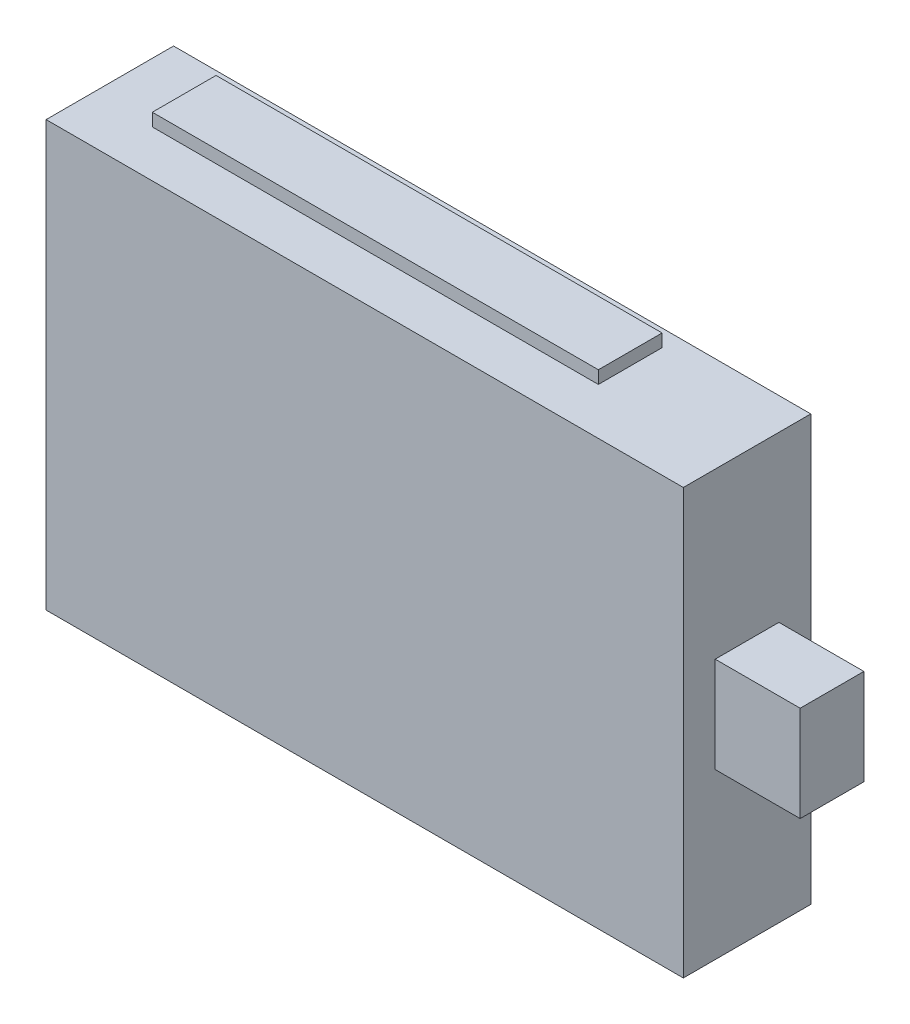
ISO-10303-21;
HEADER;
FILE_DESCRIPTION(('STEP AP214'),'2;1');
FILE_NAME('part.step','',(''),(''),'','','');
FILE_SCHEMA(('AUTOMOTIVE_DESIGN { 1 0 10303 214 1 1 1 1 }'));
ENDSEC;
DATA;
#1=APPLICATION_CONTEXT('core data for automotive mechanical design processes');
#2=APPLICATION_PROTOCOL_DEFINITION('international standard','automotive_design',2000,#1);
#3=PRODUCT_CONTEXT('',#1,'mechanical');
#4=PRODUCT('Part','Part','',(#3));
#5=PRODUCT_RELATED_PRODUCT_CATEGORY('part','',(#4));
#6=PRODUCT_DEFINITION_FORMATION('','',#4);
#7=PRODUCT_DEFINITION_CONTEXT('part definition',#1,'design');
#8=PRODUCT_DEFINITION('design','',#6,#7);
#9=PRODUCT_DEFINITION_SHAPE('','',#8);
#10=(LENGTH_UNIT() NAMED_UNIT(*) SI_UNIT(.MILLI.,.METRE.));
#11=(NAMED_UNIT(*) PLANE_ANGLE_UNIT() SI_UNIT($,.RADIAN.));
#12=(NAMED_UNIT(*) SI_UNIT($,.STERADIAN.) SOLID_ANGLE_UNIT());
#13=UNCERTAINTY_MEASURE_WITH_UNIT(LENGTH_MEASURE(1.E-05),#10,'distance_accuracy_value','');
#14=(GEOMETRIC_REPRESENTATION_CONTEXT(3) GLOBAL_UNCERTAINTY_ASSIGNED_CONTEXT((#13)) GLOBAL_UNIT_ASSIGNED_CONTEXT((#10,
#11,#12)) REPRESENTATION_CONTEXT('',''));
#15=CARTESIAN_POINT('',(0.,0.,0.));
#16=DIRECTION('',(0.,0.,1.));
#17=DIRECTION('',(1.,0.,0.));
#18=AXIS2_PLACEMENT_3D('',#15,#16,#17);
#19=CARTESIAN_POINT('',(21.,23.4,5.));
#20=DIRECTION('',(-1.,0.,0.));
#21=DIRECTION('',(0.,0.,1.));
#22=AXIS2_PLACEMENT_3D('',#19,#20,#21);
#23=PLANE('',#22);
#24=DIRECTION('',(0.,1.,0.));
#25=VECTOR('',#24,1.);
#26=CARTESIAN_POINT('',(21.,23.4,-1.));
#27=LINE('',#26,#25);
#28=CARTESIAN_POINT('',(21.,23.4,-1.));
#29=VERTEX_POINT('',#28);
#30=CARTESIAN_POINT('',(21.,24.6,-1.));
#31=VERTEX_POINT('',#30);
#32=EDGE_CURVE('E109',#29,#31,#27,.T.);
#33=ORIENTED_EDGE('',*,*,#32,.T.);
#34=DIRECTION('',(0.,0.,-1.));
#35=VECTOR('',#34,1.);
#36=CARTESIAN_POINT('',(21.,24.6,5.));
#37=LINE('',#36,#35);
#38=CARTESIAN_POINT('',(21.,24.6,5.));
#39=VERTEX_POINT('',#38);
#40=EDGE_CURVE('E12',#39,#31,#37,.T.);
#41=ORIENTED_EDGE('',*,*,#40,.F.);
#42=DIRECTION('',(0.,1.,0.));
#43=VECTOR('',#42,1.);
#44=CARTESIAN_POINT('',(21.,23.4,5.));
#45=LINE('',#44,#43);
#46=CARTESIAN_POINT('',(21.,23.4,5.));
#47=VERTEX_POINT('',#46);
#48=EDGE_CURVE('E97',#47,#39,#45,.T.);
#49=ORIENTED_EDGE('',*,*,#48,.F.);
#50=DIRECTION('',(0.,0.,-1.));
#51=VECTOR('',#50,1.);
#52=CARTESIAN_POINT('',(21.,23.4,5.));
#53=LINE('',#52,#51);
#54=EDGE_CURVE('E105',#47,#29,#53,.T.);
#55=ORIENTED_EDGE('',*,*,#54,.T.);
#56=EDGE_LOOP('',(#33,#41,#49,#55));
#57=FACE_BOUND('',#56,.T.);
#58=ADVANCED_FACE('F46',(#57),#23,.F.);
#59=CARTESIAN_POINT('',(-21.,24.6,5.));
#60=DIRECTION('',(0.,-1.,0.));
#61=DIRECTION('',(0.,0.,-1.));
#62=AXIS2_PLACEMENT_3D('',#59,#60,#61);
#63=PLANE('',#62);
#64=DIRECTION('',(-1.,0.,0.));
#65=VECTOR('',#64,1.);
#66=CARTESIAN_POINT('',(-21.,24.6,-1.));
#67=LINE('',#66,#65);
#68=CARTESIAN_POINT('',(-21.,24.6,-1.));
#69=VERTEX_POINT('',#68);
#70=EDGE_CURVE('E101',#31,#69,#67,.T.);
#71=ORIENTED_EDGE('',*,*,#70,.T.);
#72=DIRECTION('',(0.,0.,-1.));
#73=VECTOR('',#72,1.);
#74=CARTESIAN_POINT('',(-21.,24.6,5.));
#75=LINE('',#74,#73);
#76=CARTESIAN_POINT('',(-21.,24.6,5.));
#77=VERTEX_POINT('',#76);
#78=EDGE_CURVE('E54',#77,#69,#75,.T.);
#79=ORIENTED_EDGE('',*,*,#78,.F.);
#80=DIRECTION('',(-1.,0.,0.));
#81=VECTOR('',#80,1.);
#82=CARTESIAN_POINT('',(-21.,24.6,5.));
#83=LINE('',#82,#81);
#84=EDGE_CURVE('E92',#39,#77,#83,.T.);
#85=ORIENTED_EDGE('',*,*,#84,.F.);
#86=ORIENTED_EDGE('',*,*,#40,.T.);
#87=EDGE_LOOP('',(#71,#79,#85,#86));
#88=FACE_BOUND('',#87,.T.);
#89=ADVANCED_FACE('F100',(#88),#63,.F.);
#90=CARTESIAN_POINT('',(-21.,23.4,5.));
#91=DIRECTION('',(1.,0.,0.));
#92=DIRECTION('',(0.,0.,-1.));
#93=AXIS2_PLACEMENT_3D('',#90,#91,#92);
#94=PLANE('',#93);
#95=DIRECTION('',(0.,-1.,0.));
#96=VECTOR('',#95,1.);
#97=CARTESIAN_POINT('',(-21.,23.4,-1.));
#98=LINE('',#97,#96);
#99=CARTESIAN_POINT('',(-21.,23.4,-1.));
#100=VERTEX_POINT('',#99);
#101=EDGE_CURVE('E79',#69,#100,#98,.T.);
#102=ORIENTED_EDGE('',*,*,#101,.T.);
#103=DIRECTION('',(0.,0.,-1.));
#104=VECTOR('',#103,1.);
#105=CARTESIAN_POINT('',(-21.,23.4,5.));
#106=LINE('',#105,#104);
#107=CARTESIAN_POINT('',(-21.,23.4,5.));
#108=VERTEX_POINT('',#107);
#109=EDGE_CURVE('E102',#108,#100,#106,.T.);
#110=ORIENTED_EDGE('',*,*,#109,.F.);
#111=DIRECTION('',(0.,-1.,0.));
#112=VECTOR('',#111,1.);
#113=CARTESIAN_POINT('',(-21.,23.4,5.));
#114=LINE('',#113,#112);
#115=EDGE_CURVE('E95',#77,#108,#114,.T.);
#116=ORIENTED_EDGE('',*,*,#115,.F.);
#117=ORIENTED_EDGE('',*,*,#78,.T.);
#118=EDGE_LOOP('',(#102,#110,#116,#117));
#119=FACE_BOUND('',#118,.T.);
#120=ADVANCED_FACE('F103',(#119),#94,.F.);
#121=CARTESIAN_POINT('',(-21.,23.4,5.));
#122=DIRECTION('',(0.,1.,0.));
#123=DIRECTION('',(0.,0.,1.));
#124=AXIS2_PLACEMENT_3D('',#121,#122,#123);
#125=PLANE('',#124);
#126=DIRECTION('',(1.,0.,0.));
#127=VECTOR('',#126,1.);
#128=CARTESIAN_POINT('',(-21.,23.4,-1.));
#129=LINE('',#128,#127);
#130=EDGE_CURVE('E85',#100,#29,#129,.T.);
#131=ORIENTED_EDGE('',*,*,#130,.T.);
#132=ORIENTED_EDGE('',*,*,#54,.F.);
#133=DIRECTION('',(1.,0.,0.));
#134=VECTOR('',#133,1.);
#135=CARTESIAN_POINT('',(-21.,23.4,5.));
#136=LINE('',#135,#134);
#137=EDGE_CURVE('E62',#108,#47,#136,.T.);
#138=ORIENTED_EDGE('',*,*,#137,.F.);
#139=ORIENTED_EDGE('',*,*,#109,.T.);
#140=EDGE_LOOP('',(#131,#132,#138,#139));
#141=FACE_BOUND('',#140,.T.);
#142=ADVANCED_FACE('F116',(#141),#125,.F.);
#143=CARTESIAN_POINT('',(0.,0.,5.));
#144=DIRECTION('',(0.,0.,-1.));
#145=DIRECTION('',(-1.,0.,0.));
#146=AXIS2_PLACEMENT_3D('',#143,#144,#145);
#147=PLANE('',#146);
#148=ORIENTED_EDGE('',*,*,#48,.T.);
#149=ORIENTED_EDGE('',*,*,#84,.T.);
#150=ORIENTED_EDGE('',*,*,#115,.T.);
#151=ORIENTED_EDGE('',*,*,#137,.T.);
#152=EDGE_LOOP('',(#148,#149,#150,#151));
#153=FACE_BOUND('',#152,.T.);
#154=ADVANCED_FACE('F93',(#153),#147,.F.);
#155=CARTESIAN_POINT('',(0.,0.,-1.));
#156=DIRECTION('',(0.,0.,-1.));
#157=DIRECTION('',(-1.,0.,0.));
#158=AXIS2_PLACEMENT_3D('',#155,#156,#157);
#159=PLANE('',#158);
#160=ORIENTED_EDGE('',*,*,#32,.F.);
#161=ORIENTED_EDGE('',*,*,#130,.F.);
#162=ORIENTED_EDGE('',*,*,#101,.F.);
#163=ORIENTED_EDGE('',*,*,#70,.F.);
#164=EDGE_LOOP('',(#160,#161,#162,#163));
#165=FACE_BOUND('',#164,.T.);
#166=ADVANCED_FACE('F119',(#165),#159,.T.);
#167=CLOSED_SHELL('',(#58,#89,#120,#142,#154,#166));
#168=MANIFOLD_SOLID_BREP('B2',#167);
#169=CARTESIAN_POINT('',(38.,-4.5,3.));
#170=DIRECTION('',(-1.,0.,0.));
#171=DIRECTION('',(0.,0.,1.));
#172=AXIS2_PLACEMENT_3D('',#169,#170,#171);
#173=PLANE('',#172);
#174=DIRECTION('',(0.,1.,0.));
#175=VECTOR('',#174,1.);
#176=CARTESIAN_POINT('',(38.,-4.5,-3.));
#177=LINE('',#176,#175);
#178=CARTESIAN_POINT('',(38.,-4.5,-3.));
#179=VERTEX_POINT('',#178);
#180=CARTESIAN_POINT('',(38.,4.5,-3.));
#181=VERTEX_POINT('',#180);
#182=EDGE_CURVE('E242',#179,#181,#177,.T.);
#183=ORIENTED_EDGE('',*,*,#182,.T.);
#184=DIRECTION('',(0.,0.,-1.));
#185=VECTOR('',#184,1.);
#186=CARTESIAN_POINT('',(38.,4.5,3.));
#187=LINE('',#186,#185);
#188=CARTESIAN_POINT('',(38.,4.5,3.));
#189=VERTEX_POINT('',#188);
#190=EDGE_CURVE('E44',#189,#181,#187,.T.);
#191=ORIENTED_EDGE('',*,*,#190,.F.);
#192=DIRECTION('',(0.,1.,0.));
#193=VECTOR('',#192,1.);
#194=CARTESIAN_POINT('',(38.,-4.5,3.));
#195=LINE('',#194,#193);
#196=CARTESIAN_POINT('',(38.,-4.5,3.));
#197=VERTEX_POINT('',#196);
#198=EDGE_CURVE('E230',#197,#189,#195,.T.);
#199=ORIENTED_EDGE('',*,*,#198,.F.);
#200=DIRECTION('',(0.,0.,-1.));
#201=VECTOR('',#200,1.);
#202=CARTESIAN_POINT('',(38.,-4.5,3.));
#203=LINE('',#202,#201);
#204=EDGE_CURVE('E238',#197,#179,#203,.T.);
#205=ORIENTED_EDGE('',*,*,#204,.T.);
#206=EDGE_LOOP('',(#183,#191,#199,#205));
#207=FACE_BOUND('',#206,.T.);
#208=ADVANCED_FACE('F179',(#207),#173,.F.);
#209=CARTESIAN_POINT('',(30.,4.5,3.));
#210=DIRECTION('',(0.,-1.,0.));
#211=DIRECTION('',(0.,0.,-1.));
#212=AXIS2_PLACEMENT_3D('',#209,#210,#211);
#213=PLANE('',#212);
#214=DIRECTION('',(-1.,0.,0.));
#215=VECTOR('',#214,1.);
#216=CARTESIAN_POINT('',(30.,4.5,-3.));
#217=LINE('',#216,#215);
#218=CARTESIAN_POINT('',(30.,4.5,-3.));
#219=VERTEX_POINT('',#218);
#220=EDGE_CURVE('E234',#181,#219,#217,.T.);
#221=ORIENTED_EDGE('',*,*,#220,.T.);
#222=DIRECTION('',(0.,0.,-1.));
#223=VECTOR('',#222,1.);
#224=CARTESIAN_POINT('',(30.,4.5,3.));
#225=LINE('',#224,#223);
#226=CARTESIAN_POINT('',(30.,4.5,3.));
#227=VERTEX_POINT('',#226);
#228=EDGE_CURVE('E187',#227,#219,#225,.T.);
#229=ORIENTED_EDGE('',*,*,#228,.F.);
#230=DIRECTION('',(-1.,0.,0.));
#231=VECTOR('',#230,1.);
#232=CARTESIAN_POINT('',(30.,4.5,3.));
#233=LINE('',#232,#231);
#234=EDGE_CURVE('E225',#189,#227,#233,.T.);
#235=ORIENTED_EDGE('',*,*,#234,.F.);
#236=ORIENTED_EDGE('',*,*,#190,.T.);
#237=EDGE_LOOP('',(#221,#229,#235,#236));
#238=FACE_BOUND('',#237,.T.);
#239=ADVANCED_FACE('F233',(#238),#213,.F.);
#240=CARTESIAN_POINT('',(30.,-4.5,3.));
#241=DIRECTION('',(1.,0.,0.));
#242=DIRECTION('',(0.,0.,-1.));
#243=AXIS2_PLACEMENT_3D('',#240,#241,#242);
#244=PLANE('',#243);
#245=DIRECTION('',(0.,-1.,0.));
#246=VECTOR('',#245,1.);
#247=CARTESIAN_POINT('',(30.,-4.5,-3.));
#248=LINE('',#247,#246);
#249=CARTESIAN_POINT('',(30.,-4.5,-3.));
#250=VERTEX_POINT('',#249);
#251=EDGE_CURVE('E212',#219,#250,#248,.T.);
#252=ORIENTED_EDGE('',*,*,#251,.T.);
#253=DIRECTION('',(0.,0.,-1.));
#254=VECTOR('',#253,1.);
#255=CARTESIAN_POINT('',(30.,-4.5,3.));
#256=LINE('',#255,#254);
#257=CARTESIAN_POINT('',(30.,-4.5,3.));
#258=VERTEX_POINT('',#257);
#259=EDGE_CURVE('E235',#258,#250,#256,.T.);
#260=ORIENTED_EDGE('',*,*,#259,.F.);
#261=DIRECTION('',(0.,-1.,0.));
#262=VECTOR('',#261,1.);
#263=CARTESIAN_POINT('',(30.,-4.5,3.));
#264=LINE('',#263,#262);
#265=EDGE_CURVE('E228',#227,#258,#264,.T.);
#266=ORIENTED_EDGE('',*,*,#265,.F.);
#267=ORIENTED_EDGE('',*,*,#228,.T.);
#268=EDGE_LOOP('',(#252,#260,#266,#267));
#269=FACE_BOUND('',#268,.T.);
#270=ADVANCED_FACE('F236',(#269),#244,.F.);
#271=CARTESIAN_POINT('',(30.,-4.5,3.));
#272=DIRECTION('',(0.,1.,0.));
#273=DIRECTION('',(0.,0.,1.));
#274=AXIS2_PLACEMENT_3D('',#271,#272,#273);
#275=PLANE('',#274);
#276=DIRECTION('',(1.,0.,0.));
#277=VECTOR('',#276,1.);
#278=CARTESIAN_POINT('',(30.,-4.5,-3.));
#279=LINE('',#278,#277);
#280=EDGE_CURVE('E218',#250,#179,#279,.T.);
#281=ORIENTED_EDGE('',*,*,#280,.T.);
#282=ORIENTED_EDGE('',*,*,#204,.F.);
#283=DIRECTION('',(1.,0.,0.));
#284=VECTOR('',#283,1.);
#285=CARTESIAN_POINT('',(30.,-4.5,3.));
#286=LINE('',#285,#284);
#287=EDGE_CURVE('E195',#258,#197,#286,.T.);
#288=ORIENTED_EDGE('',*,*,#287,.F.);
#289=ORIENTED_EDGE('',*,*,#259,.T.);
#290=EDGE_LOOP('',(#281,#282,#288,#289));
#291=FACE_BOUND('',#290,.T.);
#292=ADVANCED_FACE('F249',(#291),#275,.F.);
#293=CARTESIAN_POINT('',(0.,0.,3.));
#294=DIRECTION('',(0.,0.,-1.));
#295=DIRECTION('',(-1.,0.,0.));
#296=AXIS2_PLACEMENT_3D('',#293,#294,#295);
#297=PLANE('',#296);
#298=ORIENTED_EDGE('',*,*,#198,.T.);
#299=ORIENTED_EDGE('',*,*,#234,.T.);
#300=ORIENTED_EDGE('',*,*,#265,.T.);
#301=ORIENTED_EDGE('',*,*,#287,.T.);
#302=EDGE_LOOP('',(#298,#299,#300,#301));
#303=FACE_BOUND('',#302,.T.);
#304=ADVANCED_FACE('F226',(#303),#297,.F.);
#305=CARTESIAN_POINT('',(0.,0.,-3.));
#306=DIRECTION('',(0.,0.,-1.));
#307=DIRECTION('',(-1.,0.,0.));
#308=AXIS2_PLACEMENT_3D('',#305,#306,#307);
#309=PLANE('',#308);
#310=ORIENTED_EDGE('',*,*,#182,.F.);
#311=ORIENTED_EDGE('',*,*,#280,.F.);
#312=ORIENTED_EDGE('',*,*,#251,.F.);
#313=ORIENTED_EDGE('',*,*,#220,.F.);
#314=EDGE_LOOP('',(#310,#311,#312,#313));
#315=FACE_BOUND('',#314,.T.);
#316=ADVANCED_FACE('F252',(#315),#309,.T.);
#317=CLOSED_SHELL('',(#208,#239,#270,#292,#304,#316));
#318=MANIFOLD_SOLID_BREP('B6',#317);
#319=CARTESIAN_POINT('',(30.,-20.,6.));
#320=DIRECTION('',(-1.,0.,0.));
#321=DIRECTION('',(0.,0.,1.));
#322=AXIS2_PLACEMENT_3D('',#319,#320,#321);
#323=PLANE('',#322);
#324=DIRECTION('',(0.,1.,0.));
#325=VECTOR('',#324,1.);
#326=CARTESIAN_POINT('',(30.,-20.,-6.));
#327=LINE('',#326,#325);
#328=CARTESIAN_POINT('',(30.,-20.,-6.));
#329=VERTEX_POINT('',#328);
#330=CARTESIAN_POINT('',(30.,20.,-6.));
#331=VERTEX_POINT('',#330);
#332=EDGE_CURVE('E366',#329,#331,#327,.T.);
#333=ORIENTED_EDGE('',*,*,#332,.T.);
#334=DIRECTION('',(0.,0.,-1.));
#335=VECTOR('',#334,1.);
#336=CARTESIAN_POINT('',(30.,20.,6.));
#337=LINE('',#336,#335);
#338=CARTESIAN_POINT('',(30.,20.,6.));
#339=VERTEX_POINT('',#338);
#340=EDGE_CURVE('E177',#339,#331,#337,.T.);
#341=ORIENTED_EDGE('',*,*,#340,.F.);
#342=DIRECTION('',(0.,1.,0.));
#343=VECTOR('',#342,1.);
#344=CARTESIAN_POINT('',(30.,-20.,6.));
#345=LINE('',#344,#343);
#346=CARTESIAN_POINT('',(30.,-20.,6.));
#347=VERTEX_POINT('',#346);
#348=EDGE_CURVE('E354',#347,#339,#345,.T.);
#349=ORIENTED_EDGE('',*,*,#348,.F.);
#350=DIRECTION('',(0.,0.,-1.));
#351=VECTOR('',#350,1.);
#352=CARTESIAN_POINT('',(30.,-20.,6.));
#353=LINE('',#352,#351);
#354=EDGE_CURVE('E362',#347,#329,#353,.T.);
#355=ORIENTED_EDGE('',*,*,#354,.T.);
#356=EDGE_LOOP('',(#333,#341,#349,#355));
#357=FACE_BOUND('',#356,.T.);
#358=ADVANCED_FACE('F303',(#357),#323,.F.);
#359=CARTESIAN_POINT('',(-30.,20.,6.));
#360=DIRECTION('',(0.,-1.,0.));
#361=DIRECTION('',(0.,0.,-1.));
#362=AXIS2_PLACEMENT_3D('',#359,#360,#361);
#363=PLANE('',#362);
#364=DIRECTION('',(-1.,0.,0.));
#365=VECTOR('',#364,1.);
#366=CARTESIAN_POINT('',(-30.,20.,-6.));
#367=LINE('',#366,#365);
#368=CARTESIAN_POINT('',(-30.,20.,-6.));
#369=VERTEX_POINT('',#368);
#370=EDGE_CURVE('E358',#331,#369,#367,.T.);
#371=ORIENTED_EDGE('',*,*,#370,.T.);
#372=DIRECTION('',(0.,0.,-1.));
#373=VECTOR('',#372,1.);
#374=CARTESIAN_POINT('',(-30.,20.,6.));
#375=LINE('',#374,#373);
#376=CARTESIAN_POINT('',(-30.,20.,6.));
#377=VERTEX_POINT('',#376);
#378=EDGE_CURVE('E311',#377,#369,#375,.T.);
#379=ORIENTED_EDGE('',*,*,#378,.F.);
#380=DIRECTION('',(-1.,0.,0.));
#381=VECTOR('',#380,1.);
#382=CARTESIAN_POINT('',(-30.,20.,6.));
#383=LINE('',#382,#381);
#384=EDGE_CURVE('E349',#339,#377,#383,.T.);
#385=ORIENTED_EDGE('',*,*,#384,.F.);
#386=ORIENTED_EDGE('',*,*,#340,.T.);
#387=EDGE_LOOP('',(#371,#379,#385,#386));
#388=FACE_BOUND('',#387,.T.);
#389=ADVANCED_FACE('F357',(#388),#363,.F.);
#390=CARTESIAN_POINT('',(-30.,-20.,6.));
#391=DIRECTION('',(1.,0.,0.));
#392=DIRECTION('',(0.,0.,-1.));
#393=AXIS2_PLACEMENT_3D('',#390,#391,#392);
#394=PLANE('',#393);
#395=DIRECTION('',(0.,-1.,0.));
#396=VECTOR('',#395,1.);
#397=CARTESIAN_POINT('',(-30.,-20.,-6.));
#398=LINE('',#397,#396);
#399=CARTESIAN_POINT('',(-30.,-20.,-6.));
#400=VERTEX_POINT('',#399);
#401=EDGE_CURVE('E336',#369,#400,#398,.T.);
#402=ORIENTED_EDGE('',*,*,#401,.T.);
#403=DIRECTION('',(0.,0.,-1.));
#404=VECTOR('',#403,1.);
#405=CARTESIAN_POINT('',(-30.,-20.,6.));
#406=LINE('',#405,#404);
#407=CARTESIAN_POINT('',(-30.,-20.,6.));
#408=VERTEX_POINT('',#407);
#409=EDGE_CURVE('E359',#408,#400,#406,.T.);
#410=ORIENTED_EDGE('',*,*,#409,.F.);
#411=DIRECTION('',(0.,-1.,0.));
#412=VECTOR('',#411,1.);
#413=CARTESIAN_POINT('',(-30.,-20.,6.));
#414=LINE('',#413,#412);
#415=EDGE_CURVE('E352',#377,#408,#414,.T.);
#416=ORIENTED_EDGE('',*,*,#415,.F.);
#417=ORIENTED_EDGE('',*,*,#378,.T.);
#418=EDGE_LOOP('',(#402,#410,#416,#417));
#419=FACE_BOUND('',#418,.T.);
#420=ADVANCED_FACE('F360',(#419),#394,.F.);
#421=CARTESIAN_POINT('',(-30.,-20.,6.));
#422=DIRECTION('',(0.,1.,0.));
#423=DIRECTION('',(0.,0.,1.));
#424=AXIS2_PLACEMENT_3D('',#421,#422,#423);
#425=PLANE('',#424);
#426=DIRECTION('',(1.,0.,0.));
#427=VECTOR('',#426,1.);
#428=CARTESIAN_POINT('',(-30.,-20.,-6.));
#429=LINE('',#428,#427);
#430=EDGE_CURVE('E342',#400,#329,#429,.T.);
#431=ORIENTED_EDGE('',*,*,#430,.T.);
#432=ORIENTED_EDGE('',*,*,#354,.F.);
#433=DIRECTION('',(1.,0.,0.));
#434=VECTOR('',#433,1.);
#435=CARTESIAN_POINT('',(-30.,-20.,6.));
#436=LINE('',#435,#434);
#437=EDGE_CURVE('E319',#408,#347,#436,.T.);
#438=ORIENTED_EDGE('',*,*,#437,.F.);
#439=ORIENTED_EDGE('',*,*,#409,.T.);
#440=EDGE_LOOP('',(#431,#432,#438,#439));
#441=FACE_BOUND('',#440,.T.);
#442=ADVANCED_FACE('F373',(#441),#425,.F.);
#443=CARTESIAN_POINT('',(0.,0.,6.));
#444=DIRECTION('',(0.,0.,-1.));
#445=DIRECTION('',(-1.,0.,0.));
#446=AXIS2_PLACEMENT_3D('',#443,#444,#445);
#447=PLANE('',#446);
#448=ORIENTED_EDGE('',*,*,#348,.T.);
#449=ORIENTED_EDGE('',*,*,#384,.T.);
#450=ORIENTED_EDGE('',*,*,#415,.T.);
#451=ORIENTED_EDGE('',*,*,#437,.T.);
#452=EDGE_LOOP('',(#448,#449,#450,#451));
#453=FACE_BOUND('',#452,.T.);
#454=ADVANCED_FACE('F350',(#453),#447,.F.);
#455=CARTESIAN_POINT('',(0.,0.,-6.));
#456=DIRECTION('',(0.,0.,-1.));
#457=DIRECTION('',(-1.,0.,0.));
#458=AXIS2_PLACEMENT_3D('',#455,#456,#457);
#459=PLANE('',#458);
#460=ORIENTED_EDGE('',*,*,#332,.F.);
#461=ORIENTED_EDGE('',*,*,#430,.F.);
#462=ORIENTED_EDGE('',*,*,#401,.F.);
#463=ORIENTED_EDGE('',*,*,#370,.F.);
#464=EDGE_LOOP('',(#460,#461,#462,#463));
#465=FACE_BOUND('',#464,.T.);
#466=ADVANCED_FACE('F376',(#465),#459,.T.);
#467=CLOSED_SHELL('',(#358,#389,#420,#442,#454,#466));
#468=MANIFOLD_SOLID_BREP('B38',#467);
#469=ADVANCED_BREP_SHAPE_REPRESENTATION('',(#18,#168,#318,#468),#14);
#470=SHAPE_DEFINITION_REPRESENTATION(#9,#469);
ENDSEC;
END-ISO-10303-21;
